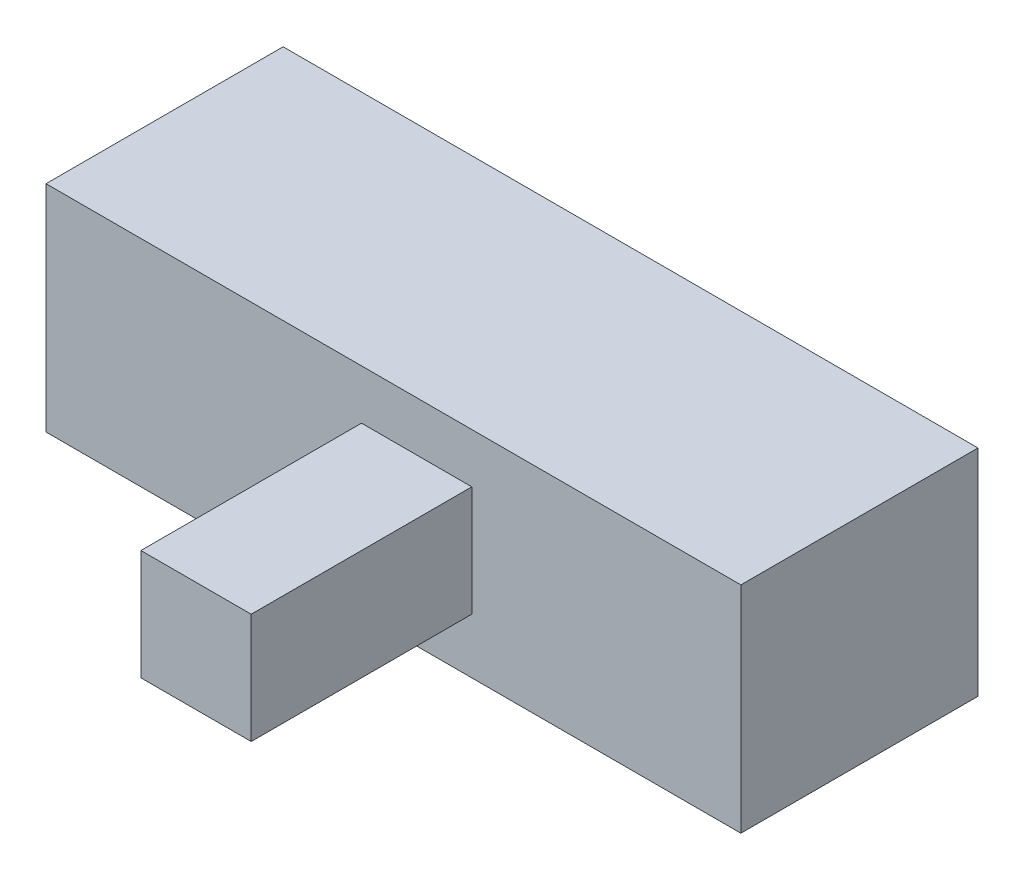
ISO-10303-21;
HEADER;
FILE_DESCRIPTION(('STEP AP214'),'2;1');
FILE_NAME('part.step','',(''),(''),'','','');
FILE_SCHEMA(('AUTOMOTIVE_DESIGN { 1 0 10303 214 1 1 1 1 }'));
ENDSEC;
DATA;
#1=APPLICATION_CONTEXT('core data for automotive mechanical design processes');
#2=APPLICATION_PROTOCOL_DEFINITION('international standard','automotive_design',2000,#1);
#3=PRODUCT_CONTEXT('',#1,'mechanical');
#4=PRODUCT('Part','Part','',(#3));
#5=PRODUCT_RELATED_PRODUCT_CATEGORY('part','',(#4));
#6=PRODUCT_DEFINITION_FORMATION('','',#4);
#7=PRODUCT_DEFINITION_CONTEXT('part definition',#1,'design');
#8=PRODUCT_DEFINITION('design','',#6,#7);
#9=PRODUCT_DEFINITION_SHAPE('','',#8);
#10=(LENGTH_UNIT() NAMED_UNIT(*) SI_UNIT(.MILLI.,.METRE.));
#11=(NAMED_UNIT(*) PLANE_ANGLE_UNIT() SI_UNIT($,.RADIAN.));
#12=(NAMED_UNIT(*) SI_UNIT($,.STERADIAN.) SOLID_ANGLE_UNIT());
#13=UNCERTAINTY_MEASURE_WITH_UNIT(LENGTH_MEASURE(1.E-05),#10,'distance_accuracy_value','');
#14=(GEOMETRIC_REPRESENTATION_CONTEXT(3) GLOBAL_UNCERTAINTY_ASSIGNED_CONTEXT((#13)) GLOBAL_UNIT_ASSIGNED_CONTEXT((#10,
#11,#12)) REPRESENTATION_CONTEXT('',''));
#15=CARTESIAN_POINT('',(0.,0.,0.));
#16=DIRECTION('',(0.,0.,1.));
#17=DIRECTION('',(1.,0.,0.));
#18=AXIS2_PLACEMENT_3D('',#15,#16,#17);
#19=CARTESIAN_POINT('',(0.,0.,4.3));
#20=DIRECTION('',(0.,0.,-1.));
#21=DIRECTION('',(-1.,0.,0.));
#22=AXIS2_PLACEMENT_3D('',#19,#20,#21);
#23=PLANE('',#22);
#24=DIRECTION('',(0.,1.,0.));
#25=VECTOR('',#24,1.);
#26=CARTESIAN_POINT('',(0.,0.,4.3));
#27=LINE('',#26,#25);
#28=CARTESIAN_POINT('',(0.,0.,4.3));
#29=VERTEX_POINT('',#28);
#30=CARTESIAN_POINT('',(0.,3.9,4.3));
#31=VERTEX_POINT('',#30);
#32=EDGE_CURVE('E129',#29,#31,#27,.T.);
#33=ORIENTED_EDGE('',*,*,#32,.F.);
#34=DIRECTION('',(1.,0.,0.));
#35=VECTOR('',#34,1.);
#36=CARTESIAN_POINT('',(0.,0.,4.3));
#37=LINE('',#36,#35);
#38=CARTESIAN_POINT('',(12.6,0.,4.3));
#39=VERTEX_POINT('',#38);
#40=EDGE_CURVE('E138',#29,#39,#37,.T.);
#41=ORIENTED_EDGE('',*,*,#40,.T.);
#42=DIRECTION('',(0.,1.,0.));
#43=VECTOR('',#42,1.);
#44=CARTESIAN_POINT('',(12.6,0.,4.3));
#45=LINE('',#44,#43);
#46=CARTESIAN_POINT('',(12.6,3.9,4.3));
#47=VERTEX_POINT('',#46);
#48=EDGE_CURVE('E136',#39,#47,#45,.T.);
#49=ORIENTED_EDGE('',*,*,#48,.T.);
#50=DIRECTION('',(1.,0.,0.));
#51=VECTOR('',#50,1.);
#52=CARTESIAN_POINT('',(0.,3.9,4.3));
#53=LINE('',#52,#51);
#54=EDGE_CURVE('E132',#31,#47,#53,.T.);
#55=ORIENTED_EDGE('',*,*,#54,.F.);
#56=EDGE_LOOP('',(#33,#41,#49,#55));
#57=FACE_BOUND('',#56,.T.);
#58=DIRECTION('',(0.,-1.,0.));
#59=VECTOR('',#58,1.);
#60=CARTESIAN_POINT('',(5.720978674584,3.,4.3));
#61=LINE('',#60,#59);
#62=CARTESIAN_POINT('',(5.720978674584,3.,4.3));
#63=VERTEX_POINT('',#62);
#64=CARTESIAN_POINT('',(5.720978674584,1.,4.3));
#65=VERTEX_POINT('',#64);
#66=EDGE_CURVE('E119',#63,#65,#61,.T.);
#67=ORIENTED_EDGE('',*,*,#66,.F.);
#68=DIRECTION('',(-1.,0.,0.));
#69=VECTOR('',#68,1.);
#70=CARTESIAN_POINT('',(5.720978674584,3.,4.3));
#71=LINE('',#70,#69);
#72=CARTESIAN_POINT('',(7.720978674584,3.,4.3));
#73=VERTEX_POINT('',#72);
#74=EDGE_CURVE('E116',#73,#63,#71,.T.);
#75=ORIENTED_EDGE('',*,*,#74,.F.);
#76=DIRECTION('',(0.,1.,0.));
#77=VECTOR('',#76,1.);
#78=CARTESIAN_POINT('',(7.720978674584,3.,4.3));
#79=LINE('',#78,#77);
#80=CARTESIAN_POINT('',(7.720978674584,1.,4.3));
#81=VERTEX_POINT('',#80);
#82=EDGE_CURVE('E55',#81,#73,#79,.T.);
#83=ORIENTED_EDGE('',*,*,#82,.F.);
#84=DIRECTION('',(1.,0.,0.));
#85=VECTOR('',#84,1.);
#86=CARTESIAN_POINT('',(5.720978674584,1.,4.3));
#87=LINE('',#86,#85);
#88=EDGE_CURVE('E50',#65,#81,#87,.T.);
#89=ORIENTED_EDGE('',*,*,#88,.F.);
#90=EDGE_LOOP('',(#67,#75,#83,#89));
#91=FACE_BOUND('',#90,.T.);
#92=ADVANCED_FACE('F33',(#57,#91),#23,.F.);
#93=CARTESIAN_POINT('',(0.,0.,4.3));
#94=DIRECTION('',(-1.,0.,0.));
#95=DIRECTION('',(0.,0.,1.));
#96=AXIS2_PLACEMENT_3D('',#93,#94,#95);
#97=PLANE('',#96);
#98=DIRECTION('',(0.,1.,0.));
#99=VECTOR('',#98,1.);
#100=CARTESIAN_POINT('',(0.,0.,0.));
#101=LINE('',#100,#99);
#102=CARTESIAN_POINT('',(0.,0.,0.));
#103=VERTEX_POINT('',#102);
#104=CARTESIAN_POINT('',(0.,3.9,0.));
#105=VERTEX_POINT('',#104);
#106=EDGE_CURVE('E120',#103,#105,#101,.T.);
#107=ORIENTED_EDGE('',*,*,#106,.F.);
#108=DIRECTION('',(0.,0.,-1.));
#109=VECTOR('',#108,1.);
#110=CARTESIAN_POINT('',(0.,0.,4.3));
#111=LINE('',#110,#109);
#112=EDGE_CURVE('E11',#29,#103,#111,.T.);
#113=ORIENTED_EDGE('',*,*,#112,.F.);
#114=ORIENTED_EDGE('',*,*,#32,.T.);
#115=DIRECTION('',(0.,0.,-1.));
#116=VECTOR('',#115,1.);
#117=CARTESIAN_POINT('',(0.,3.9,4.3));
#118=LINE('',#117,#116);
#119=EDGE_CURVE('E37',#31,#105,#118,.T.);
#120=ORIENTED_EDGE('',*,*,#119,.T.);
#121=EDGE_LOOP('',(#107,#113,#114,#120));
#122=FACE_BOUND('',#121,.T.);
#123=ADVANCED_FACE('F35',(#122),#97,.T.);
#124=CARTESIAN_POINT('',(0.,0.,4.3));
#125=DIRECTION('',(0.,1.,0.));
#126=DIRECTION('',(0.,0.,1.));
#127=AXIS2_PLACEMENT_3D('',#124,#125,#126);
#128=PLANE('',#127);
#129=DIRECTION('',(1.,0.,0.));
#130=VECTOR('',#129,1.);
#131=CARTESIAN_POINT('',(0.,0.,0.));
#132=LINE('',#131,#130);
#133=CARTESIAN_POINT('',(12.6,0.,0.));
#134=VERTEX_POINT('',#133);
#135=EDGE_CURVE('E133',#103,#134,#132,.T.);
#136=ORIENTED_EDGE('',*,*,#135,.T.);
#137=DIRECTION('',(0.,0.,-1.));
#138=VECTOR('',#137,1.);
#139=CARTESIAN_POINT('',(12.6,0.,4.3));
#140=LINE('',#139,#138);
#141=EDGE_CURVE('E42',#39,#134,#140,.T.);
#142=ORIENTED_EDGE('',*,*,#141,.F.);
#143=ORIENTED_EDGE('',*,*,#40,.F.);
#144=ORIENTED_EDGE('',*,*,#112,.T.);
#145=EDGE_LOOP('',(#136,#142,#143,#144));
#146=FACE_BOUND('',#145,.T.);
#147=ADVANCED_FACE('F162',(#146),#128,.F.);
#148=CARTESIAN_POINT('',(12.6,0.,4.3));
#149=DIRECTION('',(-1.,0.,0.));
#150=DIRECTION('',(0.,0.,1.));
#151=AXIS2_PLACEMENT_3D('',#148,#149,#150);
#152=PLANE('',#151);
#153=DIRECTION('',(0.,1.,0.));
#154=VECTOR('',#153,1.);
#155=CARTESIAN_POINT('',(12.6,0.,0.));
#156=LINE('',#155,#154);
#157=CARTESIAN_POINT('',(12.6,3.9,0.));
#158=VERTEX_POINT('',#157);
#159=EDGE_CURVE('E142',#134,#158,#156,.T.);
#160=ORIENTED_EDGE('',*,*,#159,.T.);
#161=DIRECTION('',(0.,0.,-1.));
#162=VECTOR('',#161,1.);
#163=CARTESIAN_POINT('',(12.6,3.9,4.3));
#164=LINE('',#163,#162);
#165=EDGE_CURVE('E147',#47,#158,#164,.T.);
#166=ORIENTED_EDGE('',*,*,#165,.F.);
#167=ORIENTED_EDGE('',*,*,#48,.F.);
#168=ORIENTED_EDGE('',*,*,#141,.T.);
#169=EDGE_LOOP('',(#160,#166,#167,#168));
#170=FACE_BOUND('',#169,.T.);
#171=ADVANCED_FACE('F166',(#170),#152,.F.);
#172=CARTESIAN_POINT('',(0.,3.9,4.3));
#173=DIRECTION('',(0.,1.,0.));
#174=DIRECTION('',(0.,0.,1.));
#175=AXIS2_PLACEMENT_3D('',#172,#173,#174);
#176=PLANE('',#175);
#177=DIRECTION('',(1.,0.,0.));
#178=VECTOR('',#177,1.);
#179=CARTESIAN_POINT('',(0.,3.9,0.));
#180=LINE('',#179,#178);
#181=EDGE_CURVE('E123',#105,#158,#180,.T.);
#182=ORIENTED_EDGE('',*,*,#181,.F.);
#183=ORIENTED_EDGE('',*,*,#119,.F.);
#184=ORIENTED_EDGE('',*,*,#54,.T.);
#185=ORIENTED_EDGE('',*,*,#165,.T.);
#186=EDGE_LOOP('',(#182,#183,#184,#185));
#187=FACE_BOUND('',#186,.T.);
#188=ADVANCED_FACE('F155',(#187),#176,.T.);
#189=CARTESIAN_POINT('',(0.,0.,0.));
#190=DIRECTION('',(0.,0.,-1.));
#191=DIRECTION('',(-1.,0.,0.));
#192=AXIS2_PLACEMENT_3D('',#189,#190,#191);
#193=PLANE('',#192);
#194=ORIENTED_EDGE('',*,*,#106,.T.);
#195=ORIENTED_EDGE('',*,*,#181,.T.);
#196=ORIENTED_EDGE('',*,*,#159,.F.);
#197=ORIENTED_EDGE('',*,*,#135,.F.);
#198=EDGE_LOOP('',(#194,#195,#196,#197));
#199=FACE_BOUND('',#198,.T.);
#200=ADVANCED_FACE('F159',(#199),#193,.T.);
#201=CARTESIAN_POINT('',(5.720978674584,3.,8.3));
#202=DIRECTION('',(1.,0.,0.));
#203=DIRECTION('',(0.,0.,-1.));
#204=AXIS2_PLACEMENT_3D('',#201,#202,#203);
#205=PLANE('',#204);
#206=ORIENTED_EDGE('',*,*,#66,.T.);
#207=DIRECTION('',(0.,0.,-1.));
#208=VECTOR('',#207,1.);
#209=CARTESIAN_POINT('',(5.720978674584,1.,8.3));
#210=LINE('',#209,#208);
#211=CARTESIAN_POINT('',(5.720978674584,1.,8.3));
#212=VERTEX_POINT('',#211);
#213=EDGE_CURVE('E100',#212,#65,#210,.T.);
#214=ORIENTED_EDGE('',*,*,#213,.F.);
#215=DIRECTION('',(0.,-1.,0.));
#216=VECTOR('',#215,1.);
#217=CARTESIAN_POINT('',(5.720978674584,3.,8.3));
#218=LINE('',#217,#216);
#219=CARTESIAN_POINT('',(5.720978674584,3.,8.3));
#220=VERTEX_POINT('',#219);
#221=EDGE_CURVE('E107',#220,#212,#218,.T.);
#222=ORIENTED_EDGE('',*,*,#221,.F.);
#223=DIRECTION('',(0.,0.,-1.));
#224=VECTOR('',#223,1.);
#225=CARTESIAN_POINT('',(5.720978674584,3.,8.3));
#226=LINE('',#225,#224);
#227=EDGE_CURVE('E175',#220,#63,#226,.T.);
#228=ORIENTED_EDGE('',*,*,#227,.T.);
#229=EDGE_LOOP('',(#206,#214,#222,#228));
#230=FACE_BOUND('',#229,.T.);
#231=ADVANCED_FACE('F118',(#230),#205,.F.);
#232=CARTESIAN_POINT('',(5.720978674584,1.,8.3));
#233=DIRECTION('',(0.,1.,0.));
#234=DIRECTION('',(0.,0.,1.));
#235=AXIS2_PLACEMENT_3D('',#232,#233,#234);
#236=PLANE('',#235);
#237=ORIENTED_EDGE('',*,*,#88,.T.);
#238=DIRECTION('',(0.,0.,-1.));
#239=VECTOR('',#238,1.);
#240=CARTESIAN_POINT('',(7.720978674584,1.,8.3));
#241=LINE('',#240,#239);
#242=CARTESIAN_POINT('',(7.720978674584,1.,8.3));
#243=VERTEX_POINT('',#242);
#244=EDGE_CURVE('E103',#243,#81,#241,.T.);
#245=ORIENTED_EDGE('',*,*,#244,.F.);
#246=DIRECTION('',(1.,0.,0.));
#247=VECTOR('',#246,1.);
#248=CARTESIAN_POINT('',(5.720978674584,1.,8.3));
#249=LINE('',#248,#247);
#250=EDGE_CURVE('E96',#212,#243,#249,.T.);
#251=ORIENTED_EDGE('',*,*,#250,.F.);
#252=ORIENTED_EDGE('',*,*,#213,.T.);
#253=EDGE_LOOP('',(#237,#245,#251,#252));
#254=FACE_BOUND('',#253,.T.);
#255=ADVANCED_FACE('F98',(#254),#236,.F.);
#256=CARTESIAN_POINT('',(7.720978674584,3.,8.3));
#257=DIRECTION('',(-1.,0.,0.));
#258=DIRECTION('',(0.,0.,1.));
#259=AXIS2_PLACEMENT_3D('',#256,#257,#258);
#260=PLANE('',#259);
#261=ORIENTED_EDGE('',*,*,#82,.T.);
#262=DIRECTION('',(0.,0.,-1.));
#263=VECTOR('',#262,1.);
#264=CARTESIAN_POINT('',(7.720978674584,3.,8.3));
#265=LINE('',#264,#263);
#266=CARTESIAN_POINT('',(7.720978674584,3.,8.3));
#267=VERTEX_POINT('',#266);
#268=EDGE_CURVE('E125',#267,#73,#265,.T.);
#269=ORIENTED_EDGE('',*,*,#268,.F.);
#270=DIRECTION('',(0.,1.,0.));
#271=VECTOR('',#270,1.);
#272=CARTESIAN_POINT('',(7.720978674584,3.,8.3));
#273=LINE('',#272,#271);
#274=EDGE_CURVE('E106',#243,#267,#273,.T.);
#275=ORIENTED_EDGE('',*,*,#274,.F.);
#276=ORIENTED_EDGE('',*,*,#244,.T.);
#277=EDGE_LOOP('',(#261,#269,#275,#276));
#278=FACE_BOUND('',#277,.T.);
#279=ADVANCED_FACE('F184',(#278),#260,.F.);
#280=CARTESIAN_POINT('',(5.720978674584,3.,8.3));
#281=DIRECTION('',(0.,-1.,0.));
#282=DIRECTION('',(0.,0.,-1.));
#283=AXIS2_PLACEMENT_3D('',#280,#281,#282);
#284=PLANE('',#283);
#285=ORIENTED_EDGE('',*,*,#74,.T.);
#286=ORIENTED_EDGE('',*,*,#227,.F.);
#287=DIRECTION('',(-1.,0.,0.));
#288=VECTOR('',#287,1.);
#289=CARTESIAN_POINT('',(5.720978674584,3.,8.3));
#290=LINE('',#289,#288);
#291=EDGE_CURVE('E112',#267,#220,#290,.T.);
#292=ORIENTED_EDGE('',*,*,#291,.F.);
#293=ORIENTED_EDGE('',*,*,#268,.T.);
#294=EDGE_LOOP('',(#285,#286,#292,#293));
#295=FACE_BOUND('',#294,.T.);
#296=ADVANCED_FACE('F174',(#295),#284,.F.);
#297=CARTESIAN_POINT('',(0.,0.,8.3));
#298=DIRECTION('',(0.,0.,1.));
#299=DIRECTION('',(1.,0.,0.));
#300=AXIS2_PLACEMENT_3D('',#297,#298,#299);
#301=PLANE('',#300);
#302=ORIENTED_EDGE('',*,*,#221,.T.);
#303=ORIENTED_EDGE('',*,*,#250,.T.);
#304=ORIENTED_EDGE('',*,*,#274,.T.);
#305=ORIENTED_EDGE('',*,*,#291,.T.);
#306=EDGE_LOOP('',(#302,#303,#304,#305));
#307=FACE_BOUND('',#306,.T.);
#308=ADVANCED_FACE('F110',(#307),#301,.T.);
#309=CLOSED_SHELL('',(#92,#123,#147,#171,#188,#200,#231,#255,#279,#296,#308));
#310=MANIFOLD_SOLID_BREP('B2',#309);
#311=ADVANCED_BREP_SHAPE_REPRESENTATION('',(#18,#310),#14);
#312=SHAPE_DEFINITION_REPRESENTATION(#9,#311);
ENDSEC;
END-ISO-10303-21;
